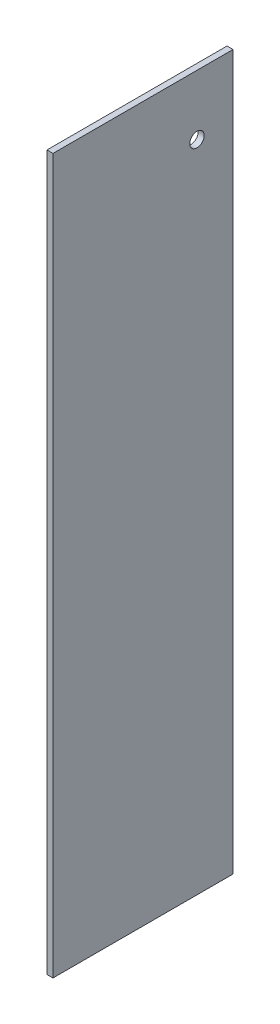
ISO-10303-21;
HEADER;
FILE_DESCRIPTION(('STEP AP214'),'2;1');
FILE_NAME('part.step','',(''),(''),'','','');
FILE_SCHEMA(('AUTOMOTIVE_DESIGN { 1 0 10303 214 1 1 1 1 }'));
ENDSEC;
DATA;
#1=APPLICATION_CONTEXT('core data for automotive mechanical design processes');
#2=APPLICATION_PROTOCOL_DEFINITION('international standard','automotive_design',2000,#1);
#3=PRODUCT_CONTEXT('',#1,'mechanical');
#4=PRODUCT('Part','Part','',(#3));
#5=PRODUCT_RELATED_PRODUCT_CATEGORY('part','',(#4));
#6=PRODUCT_DEFINITION_FORMATION('','',#4);
#7=PRODUCT_DEFINITION_CONTEXT('part definition',#1,'design');
#8=PRODUCT_DEFINITION('design','',#6,#7);
#9=PRODUCT_DEFINITION_SHAPE('','',#8);
#10=(LENGTH_UNIT() NAMED_UNIT(*) SI_UNIT(.MILLI.,.METRE.));
#11=(NAMED_UNIT(*) PLANE_ANGLE_UNIT() SI_UNIT($,.RADIAN.));
#12=(NAMED_UNIT(*) SI_UNIT($,.STERADIAN.) SOLID_ANGLE_UNIT());
#13=UNCERTAINTY_MEASURE_WITH_UNIT(LENGTH_MEASURE(1.E-05),#10,'distance_accuracy_value','');
#14=(GEOMETRIC_REPRESENTATION_CONTEXT(3) GLOBAL_UNCERTAINTY_ASSIGNED_CONTEXT((#13)) GLOBAL_UNIT_ASSIGNED_CONTEXT((#10,
#11,#12)) REPRESENTATION_CONTEXT('',''));
#15=CARTESIAN_POINT('',(0.,0.,0.));
#16=DIRECTION('',(0.,0.,1.));
#17=DIRECTION('',(1.,0.,0.));
#18=AXIS2_PLACEMENT_3D('',#15,#16,#17);
#19=CARTESIAN_POINT('',(0.,0.,95.25));
#20=DIRECTION('',(1.,0.,0.));
#21=DIRECTION('',(0.,0.,-1.));
#22=AXIS2_PLACEMENT_3D('',#19,#20,#21);
#23=PLANE('',#22);
#24=CARTESIAN_POINT('',(0.,349.25,19.05));
#25=DIRECTION('',(-1.,0.,0.));
#26=DIRECTION('',(0.,0.,1.));
#27=AXIS2_PLACEMENT_3D('',#24,#25,#26);
#28=CIRCLE('',#27,3.80999999999998);
#29=CARTESIAN_POINT('',(0.,349.25,22.86));
#30=VERTEX_POINT('',#29);
#31=EDGE_CURVE('E113',#30,#30,#28,.T.);
#32=ORIENTED_EDGE('',*,*,#31,.F.);
#33=EDGE_LOOP('',(#32));
#34=FACE_BOUND('',#33,.T.);
#35=DIRECTION('',(0.,0.,1.));
#36=VECTOR('',#35,1.);
#37=CARTESIAN_POINT('',(0.,3.17499999999998,95.25));
#38=LINE('',#37,#36);
#39=CARTESIAN_POINT('',(0.,3.175,0.));
#40=VERTEX_POINT('',#39);
#41=CARTESIAN_POINT('',(0.,3.17500000000009,95.25));
#42=VERTEX_POINT('',#41);
#43=EDGE_CURVE('E54',#40,#42,#38,.T.);
#44=ORIENTED_EDGE('',*,*,#43,.T.);
#45=DIRECTION('',(0.,-1.,0.));
#46=VECTOR('',#45,1.);
#47=CARTESIAN_POINT('',(0.,0.,95.25));
#48=LINE('',#47,#46);
#49=CARTESIAN_POINT('',(0.,381.,95.25));
#50=VERTEX_POINT('',#49);
#51=EDGE_CURVE('E91',#50,#42,#48,.T.);
#52=ORIENTED_EDGE('',*,*,#51,.F.);
#53=DIRECTION('',(0.,0.,-1.));
#54=VECTOR('',#53,1.);
#55=CARTESIAN_POINT('',(0.,381.,95.25));
#56=LINE('',#55,#54);
#57=CARTESIAN_POINT('',(0.,381.,0.));
#58=VERTEX_POINT('',#57);
#59=EDGE_CURVE('E79',#50,#58,#56,.T.);
#60=ORIENTED_EDGE('',*,*,#59,.T.);
#61=DIRECTION('',(0.,-1.,0.));
#62=VECTOR('',#61,1.);
#63=CARTESIAN_POINT('',(0.,0.,0.));
#64=LINE('',#63,#62);
#65=EDGE_CURVE('E86',#58,#40,#64,.T.);
#66=ORIENTED_EDGE('',*,*,#65,.T.);
#67=EDGE_LOOP('',(#44,#52,#60,#66));
#68=FACE_BOUND('',#67,.T.);
#69=ADVANCED_FACE('F38',(#34,#68),#23,.F.);
#70=CARTESIAN_POINT('',(0.,0.,95.25));
#71=DIRECTION('',(0.,0.,-1.));
#72=DIRECTION('',(-1.,0.,0.));
#73=AXIS2_PLACEMENT_3D('',#70,#71,#72);
#74=PLANE('',#73);
#75=DIRECTION('',(1.,0.,0.));
#76=VECTOR('',#75,1.);
#77=CARTESIAN_POINT('',(473.075,3.17499999999998,95.25));
#78=LINE('',#77,#76);
#79=CARTESIAN_POINT('',(3.17499999999998,3.17499999999998,95.25));
#80=VERTEX_POINT('',#79);
#81=EDGE_CURVE('E118',#42,#80,#78,.T.);
#82=ORIENTED_EDGE('',*,*,#81,.T.);
#83=DIRECTION('',(0.,1.,0.));
#84=VECTOR('',#83,1.);
#85=CARTESIAN_POINT('',(3.175,381.,95.25));
#86=LINE('',#85,#84);
#87=CARTESIAN_POINT('',(3.175,381.,95.25));
#88=VERTEX_POINT('',#87);
#89=EDGE_CURVE('E97',#80,#88,#86,.T.);
#90=ORIENTED_EDGE('',*,*,#89,.T.);
#91=DIRECTION('',(-1.,0.,0.));
#92=VECTOR('',#91,1.);
#93=CARTESIAN_POINT('',(0.,381.,95.25));
#94=LINE('',#93,#92);
#95=EDGE_CURVE('E63',#88,#50,#94,.T.);
#96=ORIENTED_EDGE('',*,*,#95,.T.);
#97=ORIENTED_EDGE('',*,*,#51,.T.);
#98=EDGE_LOOP('',(#82,#90,#96,#97));
#99=FACE_BOUND('',#98,.T.);
#100=ADVANCED_FACE('F130',(#99),#74,.F.);
#101=CARTESIAN_POINT('',(0.,0.,0.));
#102=DIRECTION('',(0.,0.,-1.));
#103=DIRECTION('',(-1.,0.,0.));
#104=AXIS2_PLACEMENT_3D('',#101,#102,#103);
#105=PLANE('',#104);
#106=DIRECTION('',(0.,1.,0.));
#107=VECTOR('',#106,1.);
#108=CARTESIAN_POINT('',(3.175,381.,0.));
#109=LINE('',#108,#107);
#110=CARTESIAN_POINT('',(3.17499999999998,3.17499999999998,0.));
#111=VERTEX_POINT('',#110);
#112=CARTESIAN_POINT('',(3.175,381.,0.));
#113=VERTEX_POINT('',#112);
#114=EDGE_CURVE('E87',#111,#113,#109,.T.);
#115=ORIENTED_EDGE('',*,*,#114,.F.);
#116=DIRECTION('',(-1.,0.,0.));
#117=VECTOR('',#116,1.);
#118=CARTESIAN_POINT('',(473.075,3.17499999999998,0.));
#119=LINE('',#118,#117);
#120=EDGE_CURVE('E95',#111,#40,#119,.T.);
#121=ORIENTED_EDGE('',*,*,#120,.T.);
#122=ORIENTED_EDGE('',*,*,#65,.F.);
#123=DIRECTION('',(-1.,0.,0.));
#124=VECTOR('',#123,1.);
#125=CARTESIAN_POINT('',(0.,381.,0.));
#126=LINE('',#125,#124);
#127=EDGE_CURVE('E76',#113,#58,#126,.T.);
#128=ORIENTED_EDGE('',*,*,#127,.F.);
#129=EDGE_LOOP('',(#115,#121,#122,#128));
#130=FACE_BOUND('',#129,.T.);
#131=ADVANCED_FACE('F94',(#130),#105,.T.);
#132=CARTESIAN_POINT('',(3.175,381.,95.25));
#133=DIRECTION('',(-1.,0.,0.));
#134=DIRECTION('',(0.,-1.,0.));
#135=AXIS2_PLACEMENT_3D('',#132,#133,#134);
#136=PLANE('',#135);
#137=CARTESIAN_POINT('',(3.175,349.25,19.05));
#138=DIRECTION('',(-1.,0.,0.));
#139=DIRECTION('',(0.,-1.,0.));
#140=AXIS2_PLACEMENT_3D('',#137,#138,#139);
#141=CIRCLE('',#140,3.80999999999998);
#142=CARTESIAN_POINT('',(3.175,345.44,19.05));
#143=VERTEX_POINT('',#142);
#144=EDGE_CURVE('E109',#143,#143,#141,.T.);
#145=ORIENTED_EDGE('',*,*,#144,.T.);
#146=EDGE_LOOP('',(#145));
#147=FACE_BOUND('',#146,.T.);
#148=ORIENTED_EDGE('',*,*,#114,.T.);
#149=DIRECTION('',(0.,0.,-1.));
#150=VECTOR('',#149,1.);
#151=CARTESIAN_POINT('',(3.175,381.,95.25));
#152=LINE('',#151,#150);
#153=EDGE_CURVE('E47',#88,#113,#152,.T.);
#154=ORIENTED_EDGE('',*,*,#153,.F.);
#155=ORIENTED_EDGE('',*,*,#89,.F.);
#156=DIRECTION('',(0.,0.,-1.));
#157=VECTOR('',#156,1.);
#158=CARTESIAN_POINT('',(3.17500000000001,3.175,95.25));
#159=LINE('',#158,#157);
#160=EDGE_CURVE('E11',#80,#111,#159,.T.);
#161=ORIENTED_EDGE('',*,*,#160,.T.);
#162=EDGE_LOOP('',(#148,#154,#155,#161));
#163=FACE_BOUND('',#162,.T.);
#164=ADVANCED_FACE('F40',(#147,#163),#136,.F.);
#165=CARTESIAN_POINT('',(0.,381.,95.25));
#166=DIRECTION('',(0.,-1.,0.));
#167=DIRECTION('',(0.,0.,-1.));
#168=AXIS2_PLACEMENT_3D('',#165,#166,#167);
#169=PLANE('',#168);
#170=ORIENTED_EDGE('',*,*,#127,.T.);
#171=ORIENTED_EDGE('',*,*,#59,.F.);
#172=ORIENTED_EDGE('',*,*,#95,.F.);
#173=ORIENTED_EDGE('',*,*,#153,.T.);
#174=EDGE_LOOP('',(#170,#171,#172,#173));
#175=FACE_BOUND('',#174,.T.);
#176=ADVANCED_FACE('F78',(#175),#169,.F.);
#177=CARTESIAN_POINT('',(12.7,349.25,19.05));
#178=DIRECTION('',(-1.,0.,0.));
#179=DIRECTION('',(0.,0.,1.));
#180=AXIS2_PLACEMENT_3D('',#177,#178,#179);
#181=CYLINDRICAL_SURFACE('',#180,3.80999999999998);
#182=ORIENTED_EDGE('',*,*,#31,.T.);
#183=EDGE_LOOP('',(#182));
#184=FACE_BOUND('',#183,.T.);
#185=ORIENTED_EDGE('',*,*,#144,.F.);
#186=EDGE_LOOP('',(#185));
#187=FACE_BOUND('',#186,.T.);
#188=ADVANCED_FACE('F136',(#184,#187),#181,.F.);
#189=CARTESIAN_POINT('',(3.17500000000001,3.175,95.25));
#190=DIRECTION('',(0.,-1.,0.));
#191=DIRECTION('',(1.,0.,0.));
#192=AXIS2_PLACEMENT_3D('',#189,#190,#191);
#193=PLANE('',#192);
#194=ORIENTED_EDGE('',*,*,#160,.F.);
#195=ORIENTED_EDGE('',*,*,#81,.F.);
#196=ORIENTED_EDGE('',*,*,#43,.F.);
#197=ORIENTED_EDGE('',*,*,#120,.F.);
#198=EDGE_LOOP('',(#194,#195,#196,#197));
#199=FACE_BOUND('',#198,.T.);
#200=ADVANCED_FACE('F134',(#199),#193,.T.);
#201=CLOSED_SHELL('',(#69,#100,#131,#164,#176,#188,#200));
#202=MANIFOLD_SOLID_BREP('B2',#201);
#203=ADVANCED_BREP_SHAPE_REPRESENTATION('',(#18,#202),#14);
#204=SHAPE_DEFINITION_REPRESENTATION(#9,#203);
ENDSEC;
END-ISO-10303-21;
